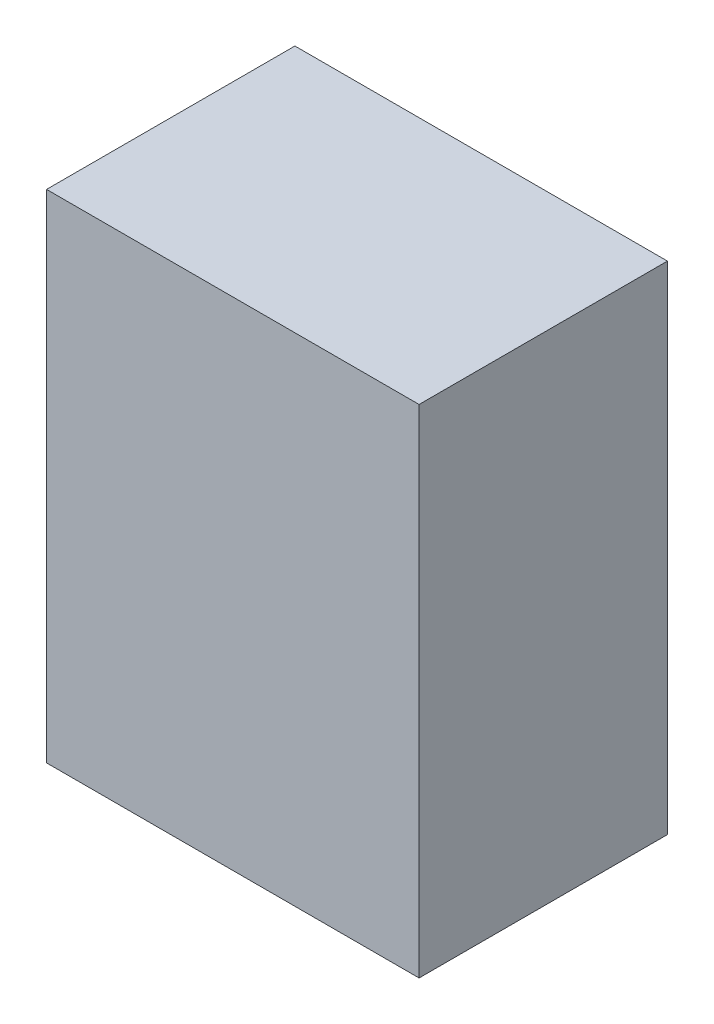
ISO-10303-21;
HEADER;
FILE_DESCRIPTION(('STEP AP214'),'2;1');
FILE_NAME('part.step','',(''),(''),'','','');
FILE_SCHEMA(('AUTOMOTIVE_DESIGN { 1 0 10303 214 1 1 1 1 }'));
ENDSEC;
DATA;
#1=APPLICATION_CONTEXT('core data for automotive mechanical design processes');
#2=APPLICATION_PROTOCOL_DEFINITION('international standard','automotive_design',2000,#1);
#3=PRODUCT_CONTEXT('',#1,'mechanical');
#4=PRODUCT('Part','Part','',(#3));
#5=PRODUCT_RELATED_PRODUCT_CATEGORY('part','',(#4));
#6=PRODUCT_DEFINITION_FORMATION('','',#4);
#7=PRODUCT_DEFINITION_CONTEXT('part definition',#1,'design');
#8=PRODUCT_DEFINITION('design','',#6,#7);
#9=PRODUCT_DEFINITION_SHAPE('','',#8);
#10=(LENGTH_UNIT() NAMED_UNIT(*) SI_UNIT(.MILLI.,.METRE.));
#11=(NAMED_UNIT(*) PLANE_ANGLE_UNIT() SI_UNIT($,.RADIAN.));
#12=(NAMED_UNIT(*) SI_UNIT($,.STERADIAN.) SOLID_ANGLE_UNIT());
#13=UNCERTAINTY_MEASURE_WITH_UNIT(LENGTH_MEASURE(1.E-05),#10,'distance_accuracy_value','');
#14=(GEOMETRIC_REPRESENTATION_CONTEXT(3) GLOBAL_UNCERTAINTY_ASSIGNED_CONTEXT((#13)) GLOBAL_UNIT_ASSIGNED_CONTEXT((#10,
#11,#12)) REPRESENTATION_CONTEXT('',''));
#15=CARTESIAN_POINT('',(0.,0.,0.));
#16=DIRECTION('',(0.,0.,1.));
#17=DIRECTION('',(1.,0.,0.));
#18=AXIS2_PLACEMENT_3D('',#15,#16,#17);
#19=CARTESIAN_POINT('',(30.,-40.,20.));
#20=DIRECTION('',(-1.,0.,0.));
#21=DIRECTION('',(0.,0.,1.));
#22=AXIS2_PLACEMENT_3D('',#19,#20,#21);
#23=PLANE('',#22);
#24=DIRECTION('',(0.,1.,0.));
#25=VECTOR('',#24,1.);
#26=CARTESIAN_POINT('',(30.,-40.,-20.));
#27=LINE('',#26,#25);
#28=CARTESIAN_POINT('',(30.,-40.,-20.));
#29=VERTEX_POINT('',#28);
#30=CARTESIAN_POINT('',(30.,40.,-20.));
#31=VERTEX_POINT('',#30);
#32=EDGE_CURVE('E96',#29,#31,#27,.T.);
#33=ORIENTED_EDGE('',*,*,#32,.T.);
#34=DIRECTION('',(0.,0.,-1.));
#35=VECTOR('',#34,1.);
#36=CARTESIAN_POINT('',(30.,40.,20.));
#37=LINE('',#36,#35);
#38=CARTESIAN_POINT('',(30.,40.,20.));
#39=VERTEX_POINT('',#38);
#40=EDGE_CURVE('E11',#39,#31,#37,.T.);
#41=ORIENTED_EDGE('',*,*,#40,.F.);
#42=DIRECTION('',(0.,1.,0.));
#43=VECTOR('',#42,1.);
#44=CARTESIAN_POINT('',(30.,-40.,20.));
#45=LINE('',#44,#43);
#46=CARTESIAN_POINT('',(30.,-40.,20.));
#47=VERTEX_POINT('',#46);
#48=EDGE_CURVE('E84',#47,#39,#45,.T.);
#49=ORIENTED_EDGE('',*,*,#48,.F.);
#50=DIRECTION('',(0.,0.,-1.));
#51=VECTOR('',#50,1.);
#52=CARTESIAN_POINT('',(30.,-40.,20.));
#53=LINE('',#52,#51);
#54=EDGE_CURVE('E92',#47,#29,#53,.T.);
#55=ORIENTED_EDGE('',*,*,#54,.T.);
#56=EDGE_LOOP('',(#33,#41,#49,#55));
#57=FACE_BOUND('',#56,.T.);
#58=ADVANCED_FACE('F33',(#57),#23,.F.);
#59=CARTESIAN_POINT('',(-30.,40.,20.));
#60=DIRECTION('',(0.,-1.,0.));
#61=DIRECTION('',(0.,0.,-1.));
#62=AXIS2_PLACEMENT_3D('',#59,#60,#61);
#63=PLANE('',#62);
#64=DIRECTION('',(-1.,0.,0.));
#65=VECTOR('',#64,1.);
#66=CARTESIAN_POINT('',(-30.,40.,-20.));
#67=LINE('',#66,#65);
#68=CARTESIAN_POINT('',(-30.,40.,-20.));
#69=VERTEX_POINT('',#68);
#70=EDGE_CURVE('E88',#31,#69,#67,.T.);
#71=ORIENTED_EDGE('',*,*,#70,.T.);
#72=DIRECTION('',(0.,0.,-1.));
#73=VECTOR('',#72,1.);
#74=CARTESIAN_POINT('',(-30.,40.,20.));
#75=LINE('',#74,#73);
#76=CARTESIAN_POINT('',(-30.,40.,20.));
#77=VERTEX_POINT('',#76);
#78=EDGE_CURVE('E41',#77,#69,#75,.T.);
#79=ORIENTED_EDGE('',*,*,#78,.F.);
#80=DIRECTION('',(-1.,0.,0.));
#81=VECTOR('',#80,1.);
#82=CARTESIAN_POINT('',(-30.,40.,20.));
#83=LINE('',#82,#81);
#84=EDGE_CURVE('E79',#39,#77,#83,.T.);
#85=ORIENTED_EDGE('',*,*,#84,.F.);
#86=ORIENTED_EDGE('',*,*,#40,.T.);
#87=EDGE_LOOP('',(#71,#79,#85,#86));
#88=FACE_BOUND('',#87,.T.);
#89=ADVANCED_FACE('F87',(#88),#63,.F.);
#90=CARTESIAN_POINT('',(-30.,-40.,20.));
#91=DIRECTION('',(1.,0.,0.));
#92=DIRECTION('',(0.,0.,-1.));
#93=AXIS2_PLACEMENT_3D('',#90,#91,#92);
#94=PLANE('',#93);
#95=DIRECTION('',(0.,-1.,0.));
#96=VECTOR('',#95,1.);
#97=CARTESIAN_POINT('',(-30.,-40.,-20.));
#98=LINE('',#97,#96);
#99=CARTESIAN_POINT('',(-30.,-40.,-20.));
#100=VERTEX_POINT('',#99);
#101=EDGE_CURVE('E66',#69,#100,#98,.T.);
#102=ORIENTED_EDGE('',*,*,#101,.T.);
#103=DIRECTION('',(0.,0.,-1.));
#104=VECTOR('',#103,1.);
#105=CARTESIAN_POINT('',(-30.,-40.,20.));
#106=LINE('',#105,#104);
#107=CARTESIAN_POINT('',(-30.,-40.,20.));
#108=VERTEX_POINT('',#107);
#109=EDGE_CURVE('E89',#108,#100,#106,.T.);
#110=ORIENTED_EDGE('',*,*,#109,.F.);
#111=DIRECTION('',(0.,-1.,0.));
#112=VECTOR('',#111,1.);
#113=CARTESIAN_POINT('',(-30.,-40.,20.));
#114=LINE('',#113,#112);
#115=EDGE_CURVE('E82',#77,#108,#114,.T.);
#116=ORIENTED_EDGE('',*,*,#115,.F.);
#117=ORIENTED_EDGE('',*,*,#78,.T.);
#118=EDGE_LOOP('',(#102,#110,#116,#117));
#119=FACE_BOUND('',#118,.T.);
#120=ADVANCED_FACE('F90',(#119),#94,.F.);
#121=CARTESIAN_POINT('',(-30.,-40.,20.));
#122=DIRECTION('',(0.,1.,0.));
#123=DIRECTION('',(0.,0.,1.));
#124=AXIS2_PLACEMENT_3D('',#121,#122,#123);
#125=PLANE('',#124);
#126=DIRECTION('',(1.,0.,0.));
#127=VECTOR('',#126,1.);
#128=CARTESIAN_POINT('',(-30.,-40.,-20.));
#129=LINE('',#128,#127);
#130=EDGE_CURVE('E72',#100,#29,#129,.T.);
#131=ORIENTED_EDGE('',*,*,#130,.T.);
#132=ORIENTED_EDGE('',*,*,#54,.F.);
#133=DIRECTION('',(1.,0.,0.));
#134=VECTOR('',#133,1.);
#135=CARTESIAN_POINT('',(-30.,-40.,20.));
#136=LINE('',#135,#134);
#137=EDGE_CURVE('E49',#108,#47,#136,.T.);
#138=ORIENTED_EDGE('',*,*,#137,.F.);
#139=ORIENTED_EDGE('',*,*,#109,.T.);
#140=EDGE_LOOP('',(#131,#132,#138,#139));
#141=FACE_BOUND('',#140,.T.);
#142=ADVANCED_FACE('F103',(#141),#125,.F.);
#143=CARTESIAN_POINT('',(0.,0.,20.));
#144=DIRECTION('',(0.,0.,-1.));
#145=DIRECTION('',(-1.,0.,0.));
#146=AXIS2_PLACEMENT_3D('',#143,#144,#145);
#147=PLANE('',#146);
#148=ORIENTED_EDGE('',*,*,#48,.T.);
#149=ORIENTED_EDGE('',*,*,#84,.T.);
#150=ORIENTED_EDGE('',*,*,#115,.T.);
#151=ORIENTED_EDGE('',*,*,#137,.T.);
#152=EDGE_LOOP('',(#148,#149,#150,#151));
#153=FACE_BOUND('',#152,.T.);
#154=ADVANCED_FACE('F80',(#153),#147,.F.);
#155=CARTESIAN_POINT('',(0.,0.,-20.));
#156=DIRECTION('',(0.,0.,-1.));
#157=DIRECTION('',(-1.,0.,0.));
#158=AXIS2_PLACEMENT_3D('',#155,#156,#157);
#159=PLANE('',#158);
#160=ORIENTED_EDGE('',*,*,#32,.F.);
#161=ORIENTED_EDGE('',*,*,#130,.F.);
#162=ORIENTED_EDGE('',*,*,#101,.F.);
#163=ORIENTED_EDGE('',*,*,#70,.F.);
#164=EDGE_LOOP('',(#160,#161,#162,#163));
#165=FACE_BOUND('',#164,.T.);
#166=ADVANCED_FACE('F106',(#165),#159,.T.);
#167=CLOSED_SHELL('',(#58,#89,#120,#142,#154,#166));
#168=MANIFOLD_SOLID_BREP('B2',#167);
#169=ADVANCED_BREP_SHAPE_REPRESENTATION('',(#18,#168),#14);
#170=SHAPE_DEFINITION_REPRESENTATION(#9,#169);
ENDSEC;
END-ISO-10303-21;
